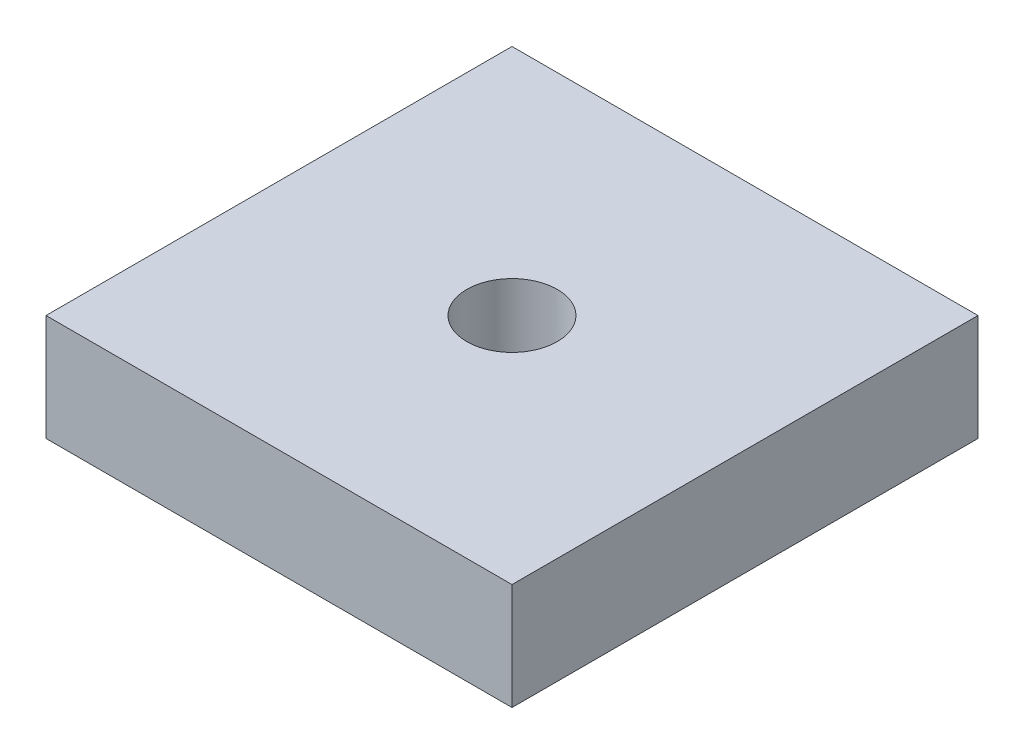
ISO-10303-21;
HEADER;
FILE_DESCRIPTION(('STEP AP214'),'2;1');
FILE_NAME('part.step','',(''),(''),'','','');
FILE_SCHEMA(('AUTOMOTIVE_DESIGN { 1 0 10303 214 1 1 1 1 }'));
ENDSEC;
DATA;
#1=APPLICATION_CONTEXT('core data for automotive mechanical design processes');
#2=APPLICATION_PROTOCOL_DEFINITION('international standard','automotive_design',2000,#1);
#3=PRODUCT_CONTEXT('',#1,'mechanical');
#4=PRODUCT('Part','Part','',(#3));
#5=PRODUCT_RELATED_PRODUCT_CATEGORY('part','',(#4));
#6=PRODUCT_DEFINITION_FORMATION('','',#4);
#7=PRODUCT_DEFINITION_CONTEXT('part definition',#1,'design');
#8=PRODUCT_DEFINITION('design','',#6,#7);
#9=PRODUCT_DEFINITION_SHAPE('','',#8);
#10=(LENGTH_UNIT() NAMED_UNIT(*) SI_UNIT(.MILLI.,.METRE.));
#11=(NAMED_UNIT(*) PLANE_ANGLE_UNIT() SI_UNIT($,.RADIAN.));
#12=(NAMED_UNIT(*) SI_UNIT($,.STERADIAN.) SOLID_ANGLE_UNIT());
#13=UNCERTAINTY_MEASURE_WITH_UNIT(LENGTH_MEASURE(1.E-05),#10,'distance_accuracy_value','');
#14=(GEOMETRIC_REPRESENTATION_CONTEXT(3) GLOBAL_UNCERTAINTY_ASSIGNED_CONTEXT((#13)) GLOBAL_UNIT_ASSIGNED_CONTEXT((#10,
#11,#12)) REPRESENTATION_CONTEXT('',''));
#15=CARTESIAN_POINT('',(0.,0.,0.));
#16=DIRECTION('',(0.,0.,1.));
#17=DIRECTION('',(1.,0.,0.));
#18=AXIS2_PLACEMENT_3D('',#15,#16,#17);
#19=CARTESIAN_POINT('',(17.5,8.,17.5));
#20=DIRECTION('',(-1.,0.,0.));
#21=DIRECTION('',(0.,0.,1.));
#22=AXIS2_PLACEMENT_3D('',#19,#20,#21);
#23=PLANE('',#22);
#24=DIRECTION('',(0.,0.,-1.));
#25=VECTOR('',#24,1.);
#26=CARTESIAN_POINT('',(17.5,0.,17.5));
#27=LINE('',#26,#25);
#28=CARTESIAN_POINT('',(17.5,0.,17.5));
#29=VERTEX_POINT('',#28);
#30=CARTESIAN_POINT('',(17.5,0.,-17.5));
#31=VERTEX_POINT('',#30);
#32=EDGE_CURVE('E115',#29,#31,#27,.T.);
#33=ORIENTED_EDGE('',*,*,#32,.T.);
#34=DIRECTION('',(0.,-1.,0.));
#35=VECTOR('',#34,1.);
#36=CARTESIAN_POINT('',(17.5,8.,-17.5));
#37=LINE('',#36,#35);
#38=CARTESIAN_POINT('',(17.5,8.,-17.5));
#39=VERTEX_POINT('',#38);
#40=EDGE_CURVE('E11',#39,#31,#37,.T.);
#41=ORIENTED_EDGE('',*,*,#40,.F.);
#42=DIRECTION('',(0.,0.,-1.));
#43=VECTOR('',#42,1.);
#44=CARTESIAN_POINT('',(17.5,8.,17.5));
#45=LINE('',#44,#43);
#46=CARTESIAN_POINT('',(17.5,8.,17.5));
#47=VERTEX_POINT('',#46);
#48=EDGE_CURVE('E99',#47,#39,#45,.T.);
#49=ORIENTED_EDGE('',*,*,#48,.F.);
#50=DIRECTION('',(0.,-1.,0.));
#51=VECTOR('',#50,1.);
#52=CARTESIAN_POINT('',(17.5,8.,17.5));
#53=LINE('',#52,#51);
#54=EDGE_CURVE('E111',#47,#29,#53,.T.);
#55=ORIENTED_EDGE('',*,*,#54,.T.);
#56=EDGE_LOOP('',(#33,#41,#49,#55));
#57=FACE_BOUND('',#56,.T.);
#58=ADVANCED_FACE('F47',(#57),#23,.F.);
#59=CARTESIAN_POINT('',(-17.5,8.,-17.5));
#60=DIRECTION('',(0.,0.,1.));
#61=DIRECTION('',(1.,0.,0.));
#62=AXIS2_PLACEMENT_3D('',#59,#60,#61);
#63=PLANE('',#62);
#64=DIRECTION('',(-1.,0.,0.));
#65=VECTOR('',#64,1.);
#66=CARTESIAN_POINT('',(-17.5,0.,-17.5));
#67=LINE('',#66,#65);
#68=CARTESIAN_POINT('',(-17.5,0.,-17.5));
#69=VERTEX_POINT('',#68);
#70=EDGE_CURVE('E104',#31,#69,#67,.T.);
#71=ORIENTED_EDGE('',*,*,#70,.T.);
#72=DIRECTION('',(0.,-1.,0.));
#73=VECTOR('',#72,1.);
#74=CARTESIAN_POINT('',(-17.5,8.,-17.5));
#75=LINE('',#74,#73);
#76=CARTESIAN_POINT('',(-17.5,8.,-17.5));
#77=VERTEX_POINT('',#76);
#78=EDGE_CURVE('E56',#77,#69,#75,.T.);
#79=ORIENTED_EDGE('',*,*,#78,.F.);
#80=DIRECTION('',(-1.,0.,0.));
#81=VECTOR('',#80,1.);
#82=CARTESIAN_POINT('',(-17.5,8.,-17.5));
#83=LINE('',#82,#81);
#84=EDGE_CURVE('E94',#39,#77,#83,.T.);
#85=ORIENTED_EDGE('',*,*,#84,.F.);
#86=ORIENTED_EDGE('',*,*,#40,.T.);
#87=EDGE_LOOP('',(#71,#79,#85,#86));
#88=FACE_BOUND('',#87,.T.);
#89=ADVANCED_FACE('F103',(#88),#63,.F.);
#90=CARTESIAN_POINT('',(-17.5,8.,17.5));
#91=DIRECTION('',(1.,0.,0.));
#92=DIRECTION('',(0.,0.,-1.));
#93=AXIS2_PLACEMENT_3D('',#90,#91,#92);
#94=PLANE('',#93);
#95=DIRECTION('',(0.,0.,1.));
#96=VECTOR('',#95,1.);
#97=CARTESIAN_POINT('',(-17.5,0.,17.5));
#98=LINE('',#97,#96);
#99=CARTESIAN_POINT('',(-17.5,0.,17.5));
#100=VERTEX_POINT('',#99);
#101=EDGE_CURVE('E81',#69,#100,#98,.T.);
#102=ORIENTED_EDGE('',*,*,#101,.T.);
#103=DIRECTION('',(0.,-1.,0.));
#104=VECTOR('',#103,1.);
#105=CARTESIAN_POINT('',(-17.5,8.,17.5));
#106=LINE('',#105,#104);
#107=CARTESIAN_POINT('',(-17.5,8.,17.5));
#108=VERTEX_POINT('',#107);
#109=EDGE_CURVE('E106',#108,#100,#106,.T.);
#110=ORIENTED_EDGE('',*,*,#109,.F.);
#111=DIRECTION('',(0.,0.,1.));
#112=VECTOR('',#111,1.);
#113=CARTESIAN_POINT('',(-17.5,8.,17.5));
#114=LINE('',#113,#112);
#115=EDGE_CURVE('E97',#77,#108,#114,.T.);
#116=ORIENTED_EDGE('',*,*,#115,.F.);
#117=ORIENTED_EDGE('',*,*,#78,.T.);
#118=EDGE_LOOP('',(#102,#110,#116,#117));
#119=FACE_BOUND('',#118,.T.);
#120=ADVANCED_FACE('F107',(#119),#94,.F.);
#121=CARTESIAN_POINT('',(-17.5,8.,17.5));
#122=DIRECTION('',(0.,0.,-1.));
#123=DIRECTION('',(-1.,0.,0.));
#124=AXIS2_PLACEMENT_3D('',#121,#122,#123);
#125=PLANE('',#124);
#126=DIRECTION('',(1.,0.,0.));
#127=VECTOR('',#126,1.);
#128=CARTESIAN_POINT('',(-17.5,0.,17.5));
#129=LINE('',#128,#127);
#130=EDGE_CURVE('E87',#100,#29,#129,.T.);
#131=ORIENTED_EDGE('',*,*,#130,.T.);
#132=ORIENTED_EDGE('',*,*,#54,.F.);
#133=DIRECTION('',(1.,0.,0.));
#134=VECTOR('',#133,1.);
#135=CARTESIAN_POINT('',(-17.5,8.,17.5));
#136=LINE('',#135,#134);
#137=EDGE_CURVE('E64',#108,#47,#136,.T.);
#138=ORIENTED_EDGE('',*,*,#137,.F.);
#139=ORIENTED_EDGE('',*,*,#109,.T.);
#140=EDGE_LOOP('',(#131,#132,#138,#139));
#141=FACE_BOUND('',#140,.T.);
#142=ADVANCED_FACE('F129',(#141),#125,.F.);
#143=CARTESIAN_POINT('',(0.,8.,0.));
#144=DIRECTION('',(0.,-1.,0.));
#145=DIRECTION('',(0.,0.,-1.));
#146=AXIS2_PLACEMENT_3D('',#143,#144,#145);
#147=PLANE('',#146);
#148=CARTESIAN_POINT('',(0.,8.,0.));
#149=DIRECTION('',(0.,1.,0.));
#150=DIRECTION('',(0.,0.,1.));
#151=AXIS2_PLACEMENT_3D('',#148,#149,#150);
#152=CIRCLE('',#151,3.39999999999999);
#153=CARTESIAN_POINT('',(0.,8.,3.39999999999999));
#154=VERTEX_POINT('',#153);
#155=EDGE_CURVE('E139',#154,#154,#152,.T.);
#156=ORIENTED_EDGE('',*,*,#155,.F.);
#157=EDGE_LOOP('',(#156));
#158=FACE_BOUND('',#157,.T.);
#159=ORIENTED_EDGE('',*,*,#48,.T.);
#160=ORIENTED_EDGE('',*,*,#84,.T.);
#161=ORIENTED_EDGE('',*,*,#115,.T.);
#162=ORIENTED_EDGE('',*,*,#137,.T.);
#163=EDGE_LOOP('',(#159,#160,#161,#162));
#164=FACE_BOUND('',#163,.T.);
#165=ADVANCED_FACE('F95',(#158,#164),#147,.F.);
#166=CARTESIAN_POINT('',(0.,0.,0.));
#167=DIRECTION('',(0.,-1.,0.));
#168=DIRECTION('',(0.,0.,-1.));
#169=AXIS2_PLACEMENT_3D('',#166,#167,#168);
#170=PLANE('',#169);
#171=CARTESIAN_POINT('',(0.,0.,0.));
#172=DIRECTION('',(0.,-1.,0.));
#173=DIRECTION('',(0.,0.,-1.));
#174=AXIS2_PLACEMENT_3D('',#171,#172,#173);
#175=CIRCLE('',#174,3.39999999999999);
#176=CARTESIAN_POINT('',(0.,0.,-3.39999999999999));
#177=VERTEX_POINT('',#176);
#178=EDGE_CURVE('E119',#177,#177,#175,.T.);
#179=ORIENTED_EDGE('',*,*,#178,.F.);
#180=EDGE_LOOP('',(#179));
#181=FACE_BOUND('',#180,.T.);
#182=ORIENTED_EDGE('',*,*,#32,.F.);
#183=ORIENTED_EDGE('',*,*,#130,.F.);
#184=ORIENTED_EDGE('',*,*,#101,.F.);
#185=ORIENTED_EDGE('',*,*,#70,.F.);
#186=EDGE_LOOP('',(#182,#183,#184,#185));
#187=FACE_BOUND('',#186,.T.);
#188=ADVANCED_FACE('F132',(#181,#187),#170,.T.);
#189=CARTESIAN_POINT('',(0.,8.,0.));
#190=DIRECTION('',(0.,1.,0.));
#191=DIRECTION('',(0.,0.,1.));
#192=AXIS2_PLACEMENT_3D('',#189,#190,#191);
#193=CYLINDRICAL_SURFACE('',#192,3.39999999999999);
#194=ORIENTED_EDGE('',*,*,#155,.T.);
#195=EDGE_LOOP('',(#194));
#196=FACE_BOUND('',#195,.T.);
#197=ORIENTED_EDGE('',*,*,#178,.T.);
#198=EDGE_LOOP('',(#197));
#199=FACE_BOUND('',#198,.T.);
#200=ADVANCED_FACE('F144',(#196,#199),#193,.F.);
#201=CLOSED_SHELL('',(#58,#89,#120,#142,#165,#188,#200));
#202=MANIFOLD_SOLID_BREP('B2',#201);
#203=ADVANCED_BREP_SHAPE_REPRESENTATION('',(#18,#202),#14);
#204=SHAPE_DEFINITION_REPRESENTATION(#9,#203);
ENDSEC;
END-ISO-10303-21;
